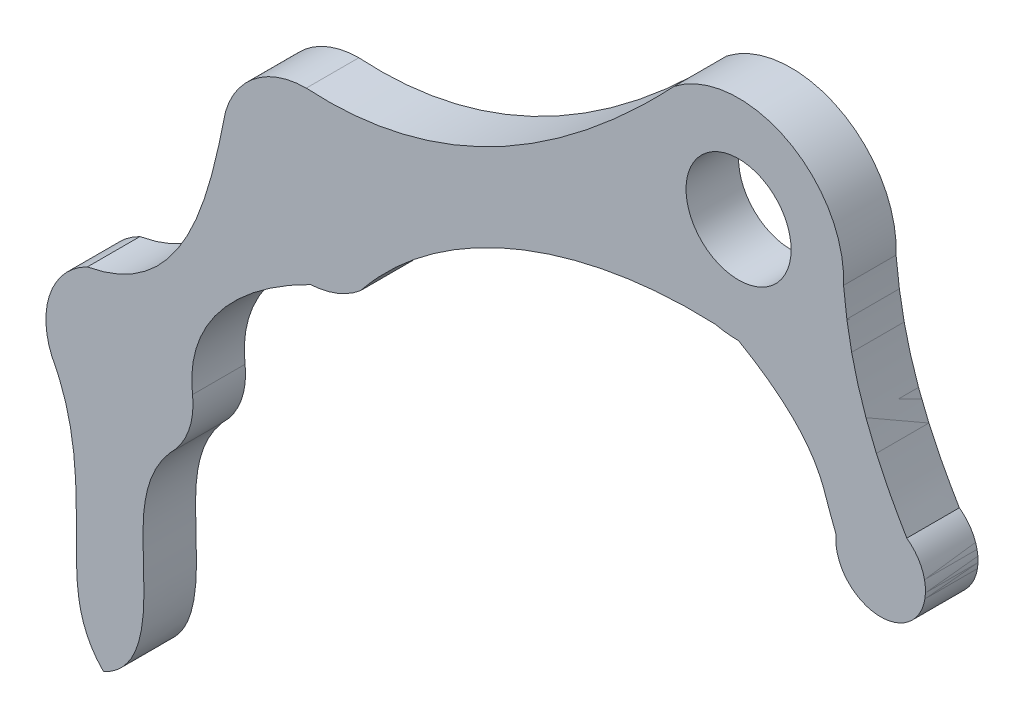
ISO-10303-21;
HEADER;
FILE_DESCRIPTION(('STEP AP214'),'2;1');
FILE_NAME('part.step','',(''),(''),'','','');
FILE_SCHEMA(('AUTOMOTIVE_DESIGN { 1 0 10303 214 1 1 1 1 }'));
ENDSEC;
DATA;
#1=APPLICATION_CONTEXT('core data for automotive mechanical design processes');
#2=APPLICATION_PROTOCOL_DEFINITION('international standard','automotive_design',2000,#1);
#3=PRODUCT_CONTEXT('',#1,'mechanical');
#4=PRODUCT('Part','Part','',(#3));
#5=PRODUCT_RELATED_PRODUCT_CATEGORY('part','',(#4));
#6=PRODUCT_DEFINITION_FORMATION('','',#4);
#7=PRODUCT_DEFINITION_CONTEXT('part definition',#1,'design');
#8=PRODUCT_DEFINITION('design','',#6,#7);
#9=PRODUCT_DEFINITION_SHAPE('','',#8);
#10=(LENGTH_UNIT() NAMED_UNIT(*) SI_UNIT(.MILLI.,.METRE.));
#11=(NAMED_UNIT(*) PLANE_ANGLE_UNIT() SI_UNIT($,.RADIAN.));
#12=(NAMED_UNIT(*) SI_UNIT($,.STERADIAN.) SOLID_ANGLE_UNIT());
#13=UNCERTAINTY_MEASURE_WITH_UNIT(LENGTH_MEASURE(1.E-05),#10,'distance_accuracy_value','');
#14=(GEOMETRIC_REPRESENTATION_CONTEXT(3) GLOBAL_UNCERTAINTY_ASSIGNED_CONTEXT((#13)) GLOBAL_UNIT_ASSIGNED_CONTEXT((#10,
#11,#12)) REPRESENTATION_CONTEXT('',''));
#15=CARTESIAN_POINT('',(0.,0.,0.));
#16=DIRECTION('',(0.,0.,1.));
#17=DIRECTION('',(1.,0.,0.));
#18=AXIS2_PLACEMENT_3D('',#15,#16,#17);
#19=CARTESIAN_POINT('',(9.9899189731047,-0.448908775065759,5.));
#20=CARTESIAN_POINT('',(10.5465937351047,-6.58116234506576,5.));
#21=CARTESIAN_POINT('',(12.2626388431047,-11.8711503130658,5.));
#22=CARTESIAN_POINT('',(15.7976941071047,-17.8958255640658,5.));
#23=CARTESIAN_POINT('',(16.0086181791047,-18.2668651700658,5.));
#24=B_SPLINE_CURVE_WITH_KNOTS('',3,(#19,#20,#21,#22,#23),.UNSPECIFIED.,.F.,.F.,(4,1,4),(0.,
0.616216276367923,0.65661098629915),.UNSPECIFIED.);
#25=DIRECTION('',(0.,0.,-1.));
#26=VECTOR('',#25,1.);
#27=SURFACE_OF_LINEAR_EXTRUSION('',#24,#26);
#28=CARTESIAN_POINT('',(9.9899189731047,-0.448908775065759,0.));
#29=CARTESIAN_POINT('',(10.5465937351047,-6.58116234506576,0.));
#30=CARTESIAN_POINT('',(12.2626388431047,-11.8711503130658,0.));
#31=CARTESIAN_POINT('',(15.7976941071047,-17.8958255640658,0.));
#32=CARTESIAN_POINT('',(16.0086181791047,-18.2668651700658,0.));
#33=B_SPLINE_CURVE_WITH_KNOTS('',3,(#28,#29,#30,#31,#32),.UNSPECIFIED.,.F.,.F.,(4,1,4),(0.,
0.616216276367923,0.65661098629915),.UNSPECIFIED.);
#34=CARTESIAN_POINT('',(9.9899189731047,-0.448908775065759,0.));
#35=VERTEX_POINT('',#34);
#36=CARTESIAN_POINT('',(16.0086181791047,-18.2668651700658,0.));
#37=VERTEX_POINT('',#36);
#38=EDGE_CURVE('E94',#35,#37,#33,.T.);
#39=ORIENTED_EDGE('',*,*,#38,.F.);
#40=DIRECTION('',(0.,0.,-1.));
#41=VECTOR('',#40,1.);
#42=CARTESIAN_POINT('',(9.9899189731047,-0.448908775065759,5.));
#43=LINE('',#42,#41);
#44=CARTESIAN_POINT('',(9.9899189731047,-0.448908775065759,5.));
#45=VERTEX_POINT('',#44);
#46=EDGE_CURVE('E48',#45,#35,#43,.T.);
#47=ORIENTED_EDGE('',*,*,#46,.F.);
#48=CARTESIAN_POINT('',(16.0086181791047,-18.2668651700658,5.));
#49=VERTEX_POINT('',#48);
#50=EDGE_CURVE('E12',#45,#49,#24,.T.);
#51=ORIENTED_EDGE('',*,*,#50,.T.);
#52=DIRECTION('',(0.,0.,-1.));
#53=VECTOR('',#52,1.);
#54=CARTESIAN_POINT('',(16.0086181791047,-18.2668651700658,5.));
#55=LINE('',#54,#53);
#56=EDGE_CURVE('E86',#49,#37,#55,.T.);
#57=ORIENTED_EDGE('',*,*,#56,.T.);
#58=EDGE_LOOP('',(#39,#47,#51,#57));
#59=FACE_BOUND('',#58,.T.);
#60=ADVANCED_FACE('F45',(#59),#27,.T.);
#61=CARTESIAN_POINT('',(13.5206104780507,-21.7339739781482,5.));
#62=DIRECTION('',(0.,0.,-1.));
#63=DIRECTION('',(-1.,0.,0.));
#64=AXIS2_PLACEMENT_3D('',#61,#62,#63);
#65=CYLINDRICAL_SURFACE('',#64,4.26743785046564);
#66=CARTESIAN_POINT('',(13.5206104780507,-21.7339739781482,0.));
#67=DIRECTION('',(0.,0.,-1.));
#68=DIRECTION('',(1.,0.,0.));
#69=AXIS2_PLACEMENT_3D('',#66,#67,#68);
#70=CIRCLE('',#69,4.26743785046564);
#71=CARTESIAN_POINT('',(9.27399303317868,-21.3129441876402,0.));
#72=VERTEX_POINT('',#71);
#73=EDGE_CURVE('E91',#37,#72,#70,.T.);
#74=ORIENTED_EDGE('',*,*,#73,.F.);
#75=ORIENTED_EDGE('',*,*,#56,.F.);
#76=CARTESIAN_POINT('',(13.5206104780507,-21.7339739781482,5.));
#77=DIRECTION('',(0.,0.,-1.));
#78=DIRECTION('',(1.,0.,0.));
#79=AXIS2_PLACEMENT_3D('',#76,#77,#78);
#80=CIRCLE('',#79,4.26743785046564);
#81=CARTESIAN_POINT('',(9.27399303317868,-21.3129441876402,5.));
#82=VERTEX_POINT('',#81);
#83=EDGE_CURVE('E89',#49,#82,#80,.T.);
#84=ORIENTED_EDGE('',*,*,#83,.T.);
#85=DIRECTION('',(0.,0.,-1.));
#86=VECTOR('',#85,1.);
#87=CARTESIAN_POINT('',(9.27399303317868,-21.3129441876402,5.));
#88=LINE('',#87,#86);
#89=EDGE_CURVE('E75',#82,#72,#88,.T.);
#90=ORIENTED_EDGE('',*,*,#89,.T.);
#91=EDGE_LOOP('',(#74,#75,#84,#90));
#92=FACE_BOUND('',#91,.T.);
#93=ADVANCED_FACE('F88',(#92),#65,.T.);
#94=CARTESIAN_POINT('',(9.27399303317868,-21.3129441876402,5.));
#95=CARTESIAN_POINT('',(8.67357700517868,-19.9406809776402,5.));
#96=CARTESIAN_POINT('',(7.51343954717868,-15.0006636276402,5.));
#97=CARTESIAN_POINT('',(2.92672997417868,-11.6867576206402,5.));
#98=CARTESIAN_POINT('',(9.17867787321299E-09,-10.0000000016402,5.));
#99=B_SPLINE_CURVE_WITH_KNOTS('',3,(#94,#95,#96,#97,#98),.UNSPECIFIED.,.F.,.F.,(4,1,4),(0.,
0.195359474976974,0.659664825790197),.UNSPECIFIED.);
#100=DIRECTION('',(0.,0.,-1.));
#101=VECTOR('',#100,1.);
#102=SURFACE_OF_LINEAR_EXTRUSION('',#99,#101);
#103=CARTESIAN_POINT('',(9.27399303317868,-21.3129441876402,0.));
#104=CARTESIAN_POINT('',(8.67357700517868,-19.9406809776402,0.));
#105=CARTESIAN_POINT('',(7.51343954717868,-15.0006636276402,0.));
#106=CARTESIAN_POINT('',(2.92672997417868,-11.6867576206402,0.));
#107=CARTESIAN_POINT('',(9.17867787321299E-09,-10.0000000016402,0.));
#108=B_SPLINE_CURVE_WITH_KNOTS('',3,(#103,#104,#105,#106,#107),.UNSPECIFIED.,.F.,.F.,(4,1,4),
(0.,0.195359474976974,0.659664825790197),.UNSPECIFIED.);
#109=CARTESIAN_POINT('',(9.17867787321299E-09,-10.0000000016402,0.));
#110=VERTEX_POINT('',#109);
#111=EDGE_CURVE('E122',#72,#110,#108,.T.);
#112=ORIENTED_EDGE('',*,*,#111,.F.);
#113=ORIENTED_EDGE('',*,*,#89,.F.);
#114=CARTESIAN_POINT('',(9.17867787321299E-09,-10.0000000016402,5.));
#115=VERTEX_POINT('',#114);
#116=EDGE_CURVE('E106',#82,#115,#99,.T.);
#117=ORIENTED_EDGE('',*,*,#116,.T.);
#118=DIRECTION('',(0.,0.,-1.));
#119=VECTOR('',#118,1.);
#120=CARTESIAN_POINT('',(9.17867787321299E-09,-10.0000000016402,5.));
#121=LINE('',#120,#119);
#122=EDGE_CURVE('E58',#115,#110,#121,.T.);
#123=ORIENTED_EDGE('',*,*,#122,.T.);
#124=EDGE_LOOP('',(#112,#113,#117,#123));
#125=FACE_BOUND('',#124,.T.);
#126=ADVANCED_FACE('F100',(#125),#102,.T.);
#127=OPEN_SHELL('',(#60,#93,#126));
#128=SHELL_BASED_SURFACE_MODEL('B2',(#127));
#129=CARTESIAN_POINT('',(-60.429953363,-67.492405783,5.));
#130=CARTESIAN_POINT('',(-63.035847799,-64.90708051,5.));
#131=CARTESIAN_POINT('',(-63.028170153,-56.438278724,5.));
#132=CARTESIAN_POINT('',(-62.948824726,-48.37679887,5.));
#133=CARTESIAN_POINT('',(-65.366552273,-43.922636472,5.));
#134=B_SPLINE_CURVE_WITH_KNOTS('',3,(#129,#130,#131,#132,#133),.UNSPECIFIED.,.F.,.F.,(4,1,4),
(0.,0.411113631679827,1.),.UNSPECIFIED.);
#135=DIRECTION('',(0.,0.,-1.));
#136=VECTOR('',#135,1.);
#137=SURFACE_OF_LINEAR_EXTRUSION('',#134,#136);
#138=CARTESIAN_POINT('',(-60.429953363,-67.492405783,0.));
#139=CARTESIAN_POINT('',(-63.035847799,-64.90708051,0.));
#140=CARTESIAN_POINT('',(-63.028170153,-56.438278724,0.));
#141=CARTESIAN_POINT('',(-62.948824726,-48.37679887,0.));
#142=CARTESIAN_POINT('',(-65.366552273,-43.922636472,0.));
#143=B_SPLINE_CURVE_WITH_KNOTS('',3,(#138,#139,#140,#141,#142),.UNSPECIFIED.,.F.,.F.,(4,1,4),
(0.,0.411113631679827,1.),.UNSPECIFIED.);
#144=CARTESIAN_POINT('',(-60.429953363,-67.492405783,0.));
#145=VERTEX_POINT('',#144);
#146=CARTESIAN_POINT('',(-65.366552273,-43.922636472,0.));
#147=VERTEX_POINT('',#146);
#148=EDGE_CURVE('E415',#145,#147,#143,.T.);
#149=ORIENTED_EDGE('',*,*,#148,.F.);
#150=DIRECTION('',(0.,0.,-1.));
#151=VECTOR('',#150,1.);
#152=CARTESIAN_POINT('',(-60.429953363,-67.492405783,5.));
#153=LINE('',#152,#151);
#154=CARTESIAN_POINT('',(-60.429953363,-67.492405783,5.));
#155=VERTEX_POINT('',#154);
#156=EDGE_CURVE('E43',#155,#145,#153,.T.);
#157=ORIENTED_EDGE('',*,*,#156,.F.);
#158=CARTESIAN_POINT('',(-65.366552273,-43.922636472,5.));
#159=VERTEX_POINT('',#158);
#160=EDGE_CURVE('E417',#155,#159,#134,.T.);
#161=ORIENTED_EDGE('',*,*,#160,.T.);
#162=DIRECTION('',(0.,0.,-1.));
#163=VECTOR('',#162,1.);
#164=CARTESIAN_POINT('',(-65.366552273,-43.922636472,5.));
#165=LINE('',#164,#163);
#166=EDGE_CURVE('E179',#159,#147,#165,.T.);
#167=ORIENTED_EDGE('',*,*,#166,.T.);
#168=EDGE_LOOP('',(#149,#157,#161,#167));
#169=FACE_BOUND('',#168,.T.);
#170=ADVANCED_FACE('F175',(#169),#137,.T.);
#171=CARTESIAN_POINT('',(-54.130381087,-46.309928491,5.));
#172=CARTESIAN_POINT('',(-57.449959784,-50.201518935,5.));
#173=CARTESIAN_POINT('',(-55.916753892,-57.608938241,5.));
#174=CARTESIAN_POINT('',(-57.103333259,-65.904114864,5.));
#175=CARTESIAN_POINT('',(-60.429953363,-67.492405783,5.));
#176=B_SPLINE_CURVE_WITH_KNOTS('',3,(#171,#172,#173,#174,#175),.UNSPECIFIED.,.F.,.F.,(4,1,4),
(0.,0.57441693739748,1.),.UNSPECIFIED.);
#177=DIRECTION('',(0.,0.,-1.));
#178=VECTOR('',#177,1.);
#179=SURFACE_OF_LINEAR_EXTRUSION('',#176,#178);
#180=CARTESIAN_POINT('',(-54.130381087,-46.309928491,0.));
#181=CARTESIAN_POINT('',(-57.449959784,-50.201518935,0.));
#182=CARTESIAN_POINT('',(-55.916753892,-57.608938241,0.));
#183=CARTESIAN_POINT('',(-57.103333259,-65.904114864,0.));
#184=CARTESIAN_POINT('',(-60.429953363,-67.492405783,0.));
#185=B_SPLINE_CURVE_WITH_KNOTS('',3,(#180,#181,#182,#183,#184),.UNSPECIFIED.,.F.,.F.,(4,1,4),
(0.,0.57441693739748,1.),.UNSPECIFIED.);
#186=CARTESIAN_POINT('',(-54.130381087,-46.309928491,0.));
#187=VERTEX_POINT('',#186);
#188=EDGE_CURVE('E423',#187,#145,#185,.T.);
#189=ORIENTED_EDGE('',*,*,#188,.F.);
#190=DIRECTION('',(0.,0.,-1.));
#191=VECTOR('',#190,1.);
#192=CARTESIAN_POINT('',(-54.130381087,-46.309928491,5.));
#193=LINE('',#192,#191);
#194=CARTESIAN_POINT('',(-54.130381087,-46.309928491,5.));
#195=VERTEX_POINT('',#194);
#196=EDGE_CURVE('E185',#195,#187,#193,.T.);
#197=ORIENTED_EDGE('',*,*,#196,.F.);
#198=EDGE_CURVE('E299',#195,#155,#176,.T.);
#199=ORIENTED_EDGE('',*,*,#198,.T.);
#200=ORIENTED_EDGE('',*,*,#156,.T.);
#201=EDGE_LOOP('',(#189,#197,#199,#200));
#202=FACE_BOUND('',#201,.T.);
#203=ADVANCED_FACE('F447',(#202),#179,.T.);
#204=CARTESIAN_POINT('',(-58.9168429668447,-41.2021126484925,5.));
#205=DIRECTION('',(0.,0.,-1.));
#206=DIRECTION('',(-1.,0.,0.));
#207=AXIS2_PLACEMENT_3D('',#204,#205,#206);
#208=CYLINDRICAL_SURFACE('',#207,7.00000000058409);
#209=CARTESIAN_POINT('',(-58.9168429668447,-41.2021126484925,0.));
#210=DIRECTION('',(0.,0.,-1.));
#211=DIRECTION('',(-1.,0.,0.));
#212=AXIS2_PLACEMENT_3D('',#209,#210,#211);
#213=CIRCLE('',#212,7.00000000058409);
#214=CARTESIAN_POINT('',(-51.9607603703315,-40.4192238194348,0.));
#215=VERTEX_POINT('',#214);
#216=EDGE_CURVE('E286',#215,#187,#213,.T.);
#217=ORIENTED_EDGE('',*,*,#216,.F.);
#218=DIRECTION('',(0.,0.,-1.));
#219=VECTOR('',#218,1.);
#220=CARTESIAN_POINT('',(-51.9607603703315,-40.4192238194348,5.));
#221=LINE('',#220,#219);
#222=CARTESIAN_POINT('',(-51.9607603703315,-40.4192238194348,5.));
#223=VERTEX_POINT('',#222);
#224=EDGE_CURVE('E281',#223,#215,#221,.T.);
#225=ORIENTED_EDGE('',*,*,#224,.F.);
#226=CARTESIAN_POINT('',(-58.9168429668447,-41.2021126484925,5.));
#227=DIRECTION('',(0.,0.,-1.));
#228=DIRECTION('',(-1.,0.,0.));
#229=AXIS2_PLACEMENT_3D('',#226,#227,#228);
#230=CIRCLE('',#229,7.00000000058409);
#231=EDGE_CURVE('E284',#223,#195,#230,.T.);
#232=ORIENTED_EDGE('',*,*,#231,.T.);
#233=ORIENTED_EDGE('',*,*,#196,.T.);
#234=EDGE_LOOP('',(#217,#225,#232,#233));
#235=FACE_BOUND('',#234,.T.);
#236=ADVANCED_FACE('F283',(#235),#208,.T.);
#237=CARTESIAN_POINT('',(-40.7273454473315,-25.7383652264348,5.));
#238=CARTESIAN_POINT('',(-46.1444167973315,-28.3742131664348,5.));
#239=CARTESIAN_POINT('',(-52.8002641013315,-33.4878347844347,5.));
#240=CARTESIAN_POINT('',(-51.9607603703315,-40.4192238194348,5.));
#241=B_SPLINE_CURVE_WITH_KNOTS('',3,(#237,#238,#239,#240),.UNSPECIFIED.,.F.,.F.,(4,4),(0.,1.),.UNSPECIFIED.);
#242=DIRECTION('',(0.,0.,-1.));
#243=VECTOR('',#242,1.);
#244=SURFACE_OF_LINEAR_EXTRUSION('',#241,#243);
#245=CARTESIAN_POINT('',(-40.7273454473315,-25.7383652264348,0.));
#246=CARTESIAN_POINT('',(-46.1444167973315,-28.3742131664348,0.));
#247=CARTESIAN_POINT('',(-52.8002641013315,-33.4878347844347,0.));
#248=CARTESIAN_POINT('',(-51.9607603703315,-40.4192238194348,0.));
#249=B_SPLINE_CURVE_WITH_KNOTS('',3,(#245,#246,#247,#248),.UNSPECIFIED.,.F.,.F.,(4,4),(0.,1.),.UNSPECIFIED.);
#250=CARTESIAN_POINT('',(-40.7273454473315,-25.7383652264348,0.));
#251=VERTEX_POINT('',#250);
#252=EDGE_CURVE('E458',#251,#215,#249,.T.);
#253=ORIENTED_EDGE('',*,*,#252,.F.);
#254=DIRECTION('',(0.,0.,-1.));
#255=VECTOR('',#254,1.);
#256=CARTESIAN_POINT('',(-40.7273454473315,-25.7383652264348,5.));
#257=LINE('',#256,#255);
#258=CARTESIAN_POINT('',(-40.7273454473315,-25.7383652264348,5.));
#259=VERTEX_POINT('',#258);
#260=EDGE_CURVE('E291',#259,#251,#257,.T.);
#261=ORIENTED_EDGE('',*,*,#260,.F.);
#262=EDGE_CURVE('E297',#259,#223,#241,.T.);
#263=ORIENTED_EDGE('',*,*,#262,.T.);
#264=ORIENTED_EDGE('',*,*,#224,.T.);
#265=EDGE_LOOP('',(#253,#261,#263,#264));
#266=FACE_BOUND('',#265,.T.);
#267=ADVANCED_FACE('F301',(#266),#244,.T.);
#268=CARTESIAN_POINT('',(-41.137795808973,-17.7489015095505,5.));
#269=DIRECTION('',(0.,0.,-1.));
#270=DIRECTION('',(-1.,0.,0.));
#271=AXIS2_PLACEMENT_3D('',#268,#269,#270);
#272=CYLINDRICAL_SURFACE('',#271,7.99999999892386);
#273=CARTESIAN_POINT('',(-41.137795808973,-17.7489015095505,0.));
#274=DIRECTION('',(0.,0.,-1.));
#275=DIRECTION('',(-1.,0.,0.));
#276=AXIS2_PLACEMENT_3D('',#273,#274,#275);
#277=CIRCLE('',#276,7.99999999892386);
#278=CARTESIAN_POINT('',(-35.9788282963538,-23.8632333770992,0.));
#279=VERTEX_POINT('',#278);
#280=EDGE_CURVE('E670',#279,#251,#277,.T.);
#281=ORIENTED_EDGE('',*,*,#280,.F.);
#282=DIRECTION('',(0.,0.,-1.));
#283=VECTOR('',#282,1.);
#284=CARTESIAN_POINT('',(-35.9788282963538,-23.8632333770992,5.));
#285=LINE('',#284,#283);
#286=CARTESIAN_POINT('',(-35.9788282963538,-23.8632333770992,5.));
#287=VERTEX_POINT('',#286);
#288=EDGE_CURVE('E469',#287,#279,#285,.T.);
#289=ORIENTED_EDGE('',*,*,#288,.F.);
#290=CARTESIAN_POINT('',(-41.137795808973,-17.7489015095505,5.));
#291=DIRECTION('',(0.,0.,-1.));
#292=DIRECTION('',(-1.,0.,0.));
#293=AXIS2_PLACEMENT_3D('',#290,#291,#292);
#294=CIRCLE('',#293,7.99999999892386);
#295=EDGE_CURVE('E302',#287,#259,#294,.T.);
#296=ORIENTED_EDGE('',*,*,#295,.T.);
#297=ORIENTED_EDGE('',*,*,#260,.T.);
#298=EDGE_LOOP('',(#281,#289,#296,#297));
#299=FACE_BOUND('',#298,.T.);
#300=ADVANCED_FACE('F318',(#299),#272,.T.);
#301=CARTESIAN_POINT('',(-2.2268631203538,-9.74890150909918,5.));
#302=CARTESIAN_POINT('',(-14.6751841963538,-9.20556970409918,5.));
#303=CARTESIAN_POINT('',(-28.0581194933538,-13.9409589860992,5.));
#304=CARTESIAN_POINT('',(-35.9788282963538,-23.8632333770992,5.));
#305=B_SPLINE_CURVE_WITH_KNOTS('',3,(#301,#302,#303,#304),.UNSPECIFIED.,.F.,.F.,(4,4),(0.,1.),.UNSPECIFIED.);
#306=DIRECTION('',(0.,0.,-1.));
#307=VECTOR('',#306,1.);
#308=SURFACE_OF_LINEAR_EXTRUSION('',#305,#307);
#309=CARTESIAN_POINT('',(-2.2268631203538,-9.74890150909918,0.));
#310=CARTESIAN_POINT('',(-14.6751841963538,-9.20556970409918,0.));
#311=CARTESIAN_POINT('',(-28.0581194933538,-13.9409589860992,0.));
#312=CARTESIAN_POINT('',(-35.9788282963538,-23.8632333770992,0.));
#313=B_SPLINE_CURVE_WITH_KNOTS('',3,(#309,#310,#311,#312),.UNSPECIFIED.,.F.,.F.,(4,4),(0.,1.),.UNSPECIFIED.);
#314=CARTESIAN_POINT('',(-2.2268631203538,-9.74890150909918,0.));
#315=VERTEX_POINT('',#314);
#316=EDGE_CURVE('E665',#315,#279,#313,.T.);
#317=ORIENTED_EDGE('',*,*,#316,.F.);
#318=DIRECTION('',(0.,0.,-1.));
#319=VECTOR('',#318,1.);
#320=CARTESIAN_POINT('',(-2.2268631203538,-9.74890150909918,5.));
#321=LINE('',#320,#319);
#322=CARTESIAN_POINT('',(-2.2268631203538,-9.74890150909918,5.));
#323=VERTEX_POINT('',#322);
#324=EDGE_CURVE('E471',#323,#315,#321,.T.);
#325=ORIENTED_EDGE('',*,*,#324,.F.);
#326=EDGE_CURVE('E304',#323,#287,#305,.T.);
#327=ORIENTED_EDGE('',*,*,#326,.T.);
#328=ORIENTED_EDGE('',*,*,#288,.T.);
#329=EDGE_LOOP('',(#317,#325,#327,#328));
#330=FACE_BOUND('',#329,.T.);
#331=ADVANCED_FACE('F322',(#330),#308,.T.);
#332=CARTESIAN_POINT('',(9.17867951782947E-09,-2.02406602763106E-09,5.));
#333=DIRECTION('',(0.,0.,-1.));
#334=DIRECTION('',(-1.,0.,0.));
#335=AXIS2_PLACEMENT_3D('',#332,#333,#334);
#336=CYLINDRICAL_SURFACE('',#335,9.99999999961613);
#337=CARTESIAN_POINT('',(9.17867951782947E-09,-2.02406602763106E-09,0.));
#338=DIRECTION('',(0.,0.,-1.));
#339=DIRECTION('',(-1.,0.,0.));
#340=AXIS2_PLACEMENT_3D('',#337,#338,#339);
#341=CIRCLE('',#340,9.99999999961613);
#342=CARTESIAN_POINT('',(9.17867787321299E-09,-10.0000000016402,0.));
#343=VERTEX_POINT('',#342);
#344=EDGE_CURVE('E659',#343,#315,#341,.T.);
#345=ORIENTED_EDGE('',*,*,#344,.F.);
#346=DIRECTION('',(0.,0.,-1.));
#347=VECTOR('',#346,1.);
#348=CARTESIAN_POINT('',(9.17867787321299E-09,-10.0000000016402,5.));
#349=LINE('',#348,#347);
#350=CARTESIAN_POINT('',(9.17867787321299E-09,-10.0000000016402,5.));
#351=VERTEX_POINT('',#350);
#352=EDGE_CURVE('E473',#351,#343,#349,.T.);
#353=ORIENTED_EDGE('',*,*,#352,.F.);
#354=CARTESIAN_POINT('',(9.17867951782947E-09,-2.02406602763106E-09,5.));
#355=DIRECTION('',(0.,0.,-1.));
#356=DIRECTION('',(-1.,0.,0.));
#357=AXIS2_PLACEMENT_3D('',#354,#355,#356);
#358=CIRCLE('',#357,9.99999999961613);
#359=EDGE_CURVE('E334',#351,#323,#358,.T.);
#360=ORIENTED_EDGE('',*,*,#359,.T.);
#361=ORIENTED_EDGE('',*,*,#324,.T.);
#362=EDGE_LOOP('',(#345,#353,#360,#361));
#363=FACE_BOUND('',#362,.T.);
#364=ADVANCED_FACE('F326',(#363),#336,.T.);
#365=CARTESIAN_POINT('',(9.27399303317868,-21.3129441876402,5.));
#366=CARTESIAN_POINT('',(8.67357700517868,-19.9406809776402,5.));
#367=CARTESIAN_POINT('',(7.51343954717868,-15.0006636276402,5.));
#368=CARTESIAN_POINT('',(2.92672997417868,-11.6867576206402,5.));
#369=CARTESIAN_POINT('',(9.17867787321299E-09,-10.0000000016402,5.));
#370=B_SPLINE_CURVE_WITH_KNOTS('',3,(#365,#366,#367,#368,#369),.UNSPECIFIED.,.F.,.F.,(4,1,4),
(0.,0.195359474976974,0.659664825790197),.UNSPECIFIED.);
#371=DIRECTION('',(0.,0.,-1.));
#372=VECTOR('',#371,1.);
#373=SURFACE_OF_LINEAR_EXTRUSION('',#370,#372);
#374=CARTESIAN_POINT('',(9.27399303317868,-21.3129441876402,0.));
#375=CARTESIAN_POINT('',(8.67357700517868,-19.9406809776402,0.));
#376=CARTESIAN_POINT('',(7.51343954717868,-15.0006636276402,0.));
#377=CARTESIAN_POINT('',(2.92672997417868,-11.6867576206402,0.));
#378=CARTESIAN_POINT('',(9.17867787321299E-09,-10.0000000016402,0.));
#379=B_SPLINE_CURVE_WITH_KNOTS('',3,(#374,#375,#376,#377,#378),.UNSPECIFIED.,.F.,.F.,(4,1,4),
(0.,0.195359474976974,0.659664825790197),.UNSPECIFIED.);
#380=CARTESIAN_POINT('',(9.27399303317868,-21.3129441876402,0.));
#381=VERTEX_POINT('',#380);
#382=EDGE_CURVE('E651',#381,#343,#379,.T.);
#383=ORIENTED_EDGE('',*,*,#382,.F.);
#384=DIRECTION('',(0.,0.,-1.));
#385=VECTOR('',#384,1.);
#386=CARTESIAN_POINT('',(9.27399303317868,-21.3129441876402,5.));
#387=LINE('',#386,#385);
#388=CARTESIAN_POINT('',(9.27399303317868,-21.3129441876402,5.));
#389=VERTEX_POINT('',#388);
#390=EDGE_CURVE('E475',#389,#381,#387,.T.);
#391=ORIENTED_EDGE('',*,*,#390,.F.);
#392=EDGE_CURVE('E340',#389,#351,#370,.T.);
#393=ORIENTED_EDGE('',*,*,#392,.T.);
#394=ORIENTED_EDGE('',*,*,#352,.T.);
#395=EDGE_LOOP('',(#383,#391,#393,#394));
#396=FACE_BOUND('',#395,.T.);
#397=ADVANCED_FACE('F354',(#396),#373,.T.);
#398=CARTESIAN_POINT('',(9.9899189731047,-0.448908775065759,5.));
#399=CARTESIAN_POINT('',(10.5465937351047,-6.58116234506576,5.));
#400=CARTESIAN_POINT('',(12.2626388431047,-11.8711503130658,5.));
#401=CARTESIAN_POINT('',(15.7976941071047,-17.8958255640658,5.));
#402=CARTESIAN_POINT('',(16.0086181791047,-18.2668651700658,5.));
#403=B_SPLINE_CURVE_WITH_KNOTS('',3,(#398,#399,#400,#401,#402),.UNSPECIFIED.,.F.,.F.,(4,1,4),
(0.,0.616216276367923,0.65661098629915),.UNSPECIFIED.);
#404=DIRECTION('',(0.,0.,-1.));
#405=VECTOR('',#404,1.);
#406=SURFACE_OF_LINEAR_EXTRUSION('',#403,#405);
#407=CARTESIAN_POINT('',(9.9899189731047,-0.448908775065759,0.));
#408=CARTESIAN_POINT('',(10.5465937351047,-6.58116234506576,0.));
#409=CARTESIAN_POINT('',(12.2626388431047,-11.8711503130658,0.));
#410=CARTESIAN_POINT('',(15.7976941071047,-17.8958255640658,0.));
#411=CARTESIAN_POINT('',(16.0086181791047,-18.2668651700658,0.));
#412=B_SPLINE_CURVE_WITH_KNOTS('',3,(#407,#408,#409,#410,#411),.UNSPECIFIED.,.F.,.F.,(4,1,4),
(0.,0.616216276367923,0.65661098629915),.UNSPECIFIED.);
#413=CARTESIAN_POINT('',(9.9899189731047,-0.448908775065758,0.));
#414=VERTEX_POINT('',#413);
#415=CARTESIAN_POINT('',(16.0086181791047,-18.2668651700658,0.));
#416=VERTEX_POINT('',#415);
#417=EDGE_CURVE('E647',#414,#416,#412,.T.);
#418=ORIENTED_EDGE('',*,*,#417,.F.);
#419=DIRECTION('',(0.,0.,-1.));
#420=VECTOR('',#419,1.);
#421=CARTESIAN_POINT('',(9.9899189731047,-0.448908775065758,5.));
#422=LINE('',#421,#420);
#423=CARTESIAN_POINT('',(9.9899189731047,-0.448908775065758,5.));
#424=VERTEX_POINT('',#423);
#425=EDGE_CURVE('E396',#424,#414,#422,.T.);
#426=ORIENTED_EDGE('',*,*,#425,.F.);
#427=CARTESIAN_POINT('',(16.0086181791047,-18.2668651700658,5.));
#428=VERTEX_POINT('',#427);
#429=EDGE_CURVE('E346',#424,#428,#403,.T.);
#430=ORIENTED_EDGE('',*,*,#429,.T.);
#431=DIRECTION('',(0.,0.,-1.));
#432=VECTOR('',#431,1.);
#433=CARTESIAN_POINT('',(16.0086181791047,-18.2668651700658,5.));
#434=LINE('',#433,#432);
#435=EDGE_CURVE('E394',#428,#416,#434,.T.);
#436=ORIENTED_EDGE('',*,*,#435,.T.);
#437=EDGE_LOOP('',(#418,#426,#430,#436));
#438=FACE_BOUND('',#437,.T.);
#439=ADVANCED_FACE('F357',(#438),#406,.T.);
#440=CARTESIAN_POINT('',(9.17867951782947E-09,-2.02406602763106E-09,5.));
#441=DIRECTION('',(0.,0.,-1.));
#442=DIRECTION('',(-1.,0.,0.));
#443=AXIS2_PLACEMENT_3D('',#440,#441,#442);
#444=CYLINDRICAL_SURFACE('',#443,9.99999999961613);
#445=CARTESIAN_POINT('',(9.17867951782947E-09,-2.02406602763106E-09,0.));
#446=DIRECTION('',(0.,0.,-1.));
#447=DIRECTION('',(-1.,0.,0.));
#448=AXIS2_PLACEMENT_3D('',#445,#446,#447);
#449=CIRCLE('',#448,9.99999999961613);
#450=CARTESIAN_POINT('',(-6.13166602059695,7.89953616737336,0.));
#451=VERTEX_POINT('',#450);
#452=EDGE_CURVE('E641',#451,#414,#449,.T.);
#453=ORIENTED_EDGE('',*,*,#452,.F.);
#454=DIRECTION('',(0.,0.,-1.));
#455=VECTOR('',#454,1.);
#456=CARTESIAN_POINT('',(-6.13166602059695,7.89953616737336,5.));
#457=LINE('',#456,#455);
#458=CARTESIAN_POINT('',(-6.13166602059695,7.89953616737336,5.));
#459=VERTEX_POINT('',#458);
#460=EDGE_CURVE('E479',#459,#451,#457,.T.);
#461=ORIENTED_EDGE('',*,*,#460,.F.);
#462=CARTESIAN_POINT('',(9.17867951782947E-09,-2.02406602763106E-09,5.));
#463=DIRECTION('',(0.,0.,-1.));
#464=DIRECTION('',(-1.,0.,0.));
#465=AXIS2_PLACEMENT_3D('',#462,#463,#464);
#466=CIRCLE('',#465,9.99999999961613);
#467=EDGE_CURVE('E379',#459,#424,#466,.T.);
#468=ORIENTED_EDGE('',*,*,#467,.T.);
#469=ORIENTED_EDGE('',*,*,#425,.T.);
#470=EDGE_LOOP('',(#453,#461,#468,#469));
#471=FACE_BOUND('',#470,.T.);
#472=ADVANCED_FACE('F361',(#471),#444,.T.);
#473=CARTESIAN_POINT('',(-41.137795801597,-9.74890151062664,5.));
#474=CARTESIAN_POINT('',(-27.2451166495969,-10.6659184816266,5.));
#475=CARTESIAN_POINT('',(-15.1399720315969,-1.65620241862664,5.));
#476=CARTESIAN_POINT('',(-6.13166602059695,7.89953616737336,5.));
#477=B_SPLINE_CURVE_WITH_KNOTS('',3,(#473,#474,#475,#476),.UNSPECIFIED.,.F.,.F.,(4,4),(0.,1.),.UNSPECIFIED.);
#478=DIRECTION('',(0.,0.,-1.));
#479=VECTOR('',#478,1.);
#480=SURFACE_OF_LINEAR_EXTRUSION('',#477,#479);
#481=CARTESIAN_POINT('',(-41.137795801597,-9.74890151062664,0.));
#482=CARTESIAN_POINT('',(-27.2451166495969,-10.6659184816266,0.));
#483=CARTESIAN_POINT('',(-15.1399720315969,-1.65620241862664,0.));
#484=CARTESIAN_POINT('',(-6.13166602059695,7.89953616737336,0.));
#485=B_SPLINE_CURVE_WITH_KNOTS('',3,(#481,#482,#483,#484),.UNSPECIFIED.,.F.,.F.,(4,4),(0.,1.),.UNSPECIFIED.);
#486=CARTESIAN_POINT('',(-41.137795801597,-9.74890151062664,0.));
#487=VERTEX_POINT('',#486);
#488=EDGE_CURVE('E628',#487,#451,#485,.T.);
#489=ORIENTED_EDGE('',*,*,#488,.F.);
#490=DIRECTION('',(0.,0.,-1.));
#491=VECTOR('',#490,1.);
#492=CARTESIAN_POINT('',(-41.137795801597,-9.74890151062664,5.));
#493=LINE('',#492,#491);
#494=CARTESIAN_POINT('',(-41.137795801597,-9.74890151062664,5.));
#495=VERTEX_POINT('',#494);
#496=EDGE_CURVE('E481',#495,#487,#493,.T.);
#497=ORIENTED_EDGE('',*,*,#496,.F.);
#498=EDGE_CURVE('E373',#495,#459,#477,.T.);
#499=ORIENTED_EDGE('',*,*,#498,.T.);
#500=ORIENTED_EDGE('',*,*,#460,.T.);
#501=EDGE_LOOP('',(#489,#497,#499,#500));
#502=FACE_BOUND('',#501,.T.);
#503=ADVANCED_FACE('F365',(#502),#480,.T.);
#504=CARTESIAN_POINT('',(-41.137795808973,-17.7489015095505,5.));
#505=DIRECTION('',(0.,0.,-1.));
#506=DIRECTION('',(-1.,0.,0.));
#507=AXIS2_PLACEMENT_3D('',#504,#505,#506);
#508=CYLINDRICAL_SURFACE('',#507,7.99999999892386);
#509=CARTESIAN_POINT('',(-41.137795808973,-17.7489015095505,0.));
#510=DIRECTION('',(0.,0.,-1.));
#511=DIRECTION('',(-1.,0.,0.));
#512=AXIS2_PLACEMENT_3D('',#509,#510,#511);
#513=CIRCLE('',#512,7.99999999892386);
#514=CARTESIAN_POINT('',(-48.815695062704,-15.5017114792373,0.));
#515=VERTEX_POINT('',#514);
#516=EDGE_CURVE('E622',#515,#487,#513,.T.);
#517=ORIENTED_EDGE('',*,*,#516,.F.);
#518=DIRECTION('',(0.,0.,-1.));
#519=VECTOR('',#518,1.);
#520=CARTESIAN_POINT('',(-48.815695062704,-15.5017114792373,5.));
#521=LINE('',#520,#519);
#522=CARTESIAN_POINT('',(-48.815695062704,-15.5017114792373,5.));
#523=VERTEX_POINT('',#522);
#524=EDGE_CURVE('E483',#523,#515,#521,.T.);
#525=ORIENTED_EDGE('',*,*,#524,.F.);
#526=CARTESIAN_POINT('',(-41.137795808973,-17.7489015095505,5.));
#527=DIRECTION('',(0.,0.,-1.));
#528=DIRECTION('',(-1.,0.,0.));
#529=AXIS2_PLACEMENT_3D('',#526,#527,#528);
#530=CIRCLE('',#529,7.99999999892386);
#531=EDGE_CURVE('E380',#523,#495,#530,.T.);
#532=ORIENTED_EDGE('',*,*,#531,.T.);
#533=ORIENTED_EDGE('',*,*,#496,.T.);
#534=EDGE_LOOP('',(#517,#525,#532,#533));
#535=FACE_BOUND('',#534,.T.);
#536=ADVANCED_FACE('F370',(#535),#508,.T.);
#537=CARTESIAN_POINT('',(-61.975170700704,-34.9055555352373,5.));
#538=CARTESIAN_POINT('',(-52.395963262704,-33.1575220672373,5.));
#539=CARTESIAN_POINT('',(-50.328955684704,-23.0829064512373,5.));
#540=CARTESIAN_POINT('',(-48.815695062704,-15.5017114792373,5.));
#541=B_SPLINE_CURVE_WITH_KNOTS('',3,(#537,#538,#539,#540),.UNSPECIFIED.,.F.,.F.,(4,4),(0.,1.),.UNSPECIFIED.);
#542=DIRECTION('',(0.,0.,-1.));
#543=VECTOR('',#542,1.);
#544=SURFACE_OF_LINEAR_EXTRUSION('',#541,#543);
#545=CARTESIAN_POINT('',(-61.975170700704,-34.9055555352373,0.));
#546=CARTESIAN_POINT('',(-52.395963262704,-33.1575220672373,0.));
#547=CARTESIAN_POINT('',(-50.328955684704,-23.0829064512373,0.));
#548=CARTESIAN_POINT('',(-48.815695062704,-15.5017114792373,0.));
#549=B_SPLINE_CURVE_WITH_KNOTS('',3,(#545,#546,#547,#548),.UNSPECIFIED.,.F.,.F.,(4,4),(0.,1.),.UNSPECIFIED.);
#550=CARTESIAN_POINT('',(-61.975170700704,-34.9055555352373,0.));
#551=VERTEX_POINT('',#550);
#552=EDGE_CURVE('E629',#551,#515,#549,.T.);
#553=ORIENTED_EDGE('',*,*,#552,.F.);
#554=DIRECTION('',(0.,0.,-1.));
#555=VECTOR('',#554,1.);
#556=CARTESIAN_POINT('',(-61.975170700704,-34.9055555352373,5.));
#557=LINE('',#556,#555);
#558=CARTESIAN_POINT('',(-61.975170700704,-34.9055555352373,5.));
#559=VERTEX_POINT('',#558);
#560=EDGE_CURVE('E484',#559,#551,#557,.T.);
#561=ORIENTED_EDGE('',*,*,#560,.F.);
#562=EDGE_CURVE('E427',#559,#523,#541,.T.);
#563=ORIENTED_EDGE('',*,*,#562,.T.);
#564=ORIENTED_EDGE('',*,*,#524,.T.);
#565=EDGE_LOOP('',(#553,#561,#563,#564));
#566=FACE_BOUND('',#565,.T.);
#567=ADVANCED_FACE('F435',(#566),#544,.T.);
#568=CARTESIAN_POINT('',(-58.9168429668447,-41.2021126484925,5.));
#569=DIRECTION('',(0.,0.,-1.));
#570=DIRECTION('',(-1.,0.,0.));
#571=AXIS2_PLACEMENT_3D('',#568,#569,#570);
#572=CYLINDRICAL_SURFACE('',#571,7.0000000005841);
#573=CARTESIAN_POINT('',(-58.9168429668447,-41.2021126484925,0.));
#574=DIRECTION('',(0.,0.,-1.));
#575=DIRECTION('',(-1.,0.,0.));
#576=AXIS2_PLACEMENT_3D('',#573,#574,#575);
#577=CIRCLE('',#576,7.0000000005841);
#578=EDGE_CURVE('E455',#147,#551,#577,.T.);
#579=ORIENTED_EDGE('',*,*,#578,.F.);
#580=ORIENTED_EDGE('',*,*,#166,.F.);
#581=CARTESIAN_POINT('',(-58.9168429668447,-41.2021126484925,5.));
#582=DIRECTION('',(0.,0.,-1.));
#583=DIRECTION('',(-1.,0.,0.));
#584=AXIS2_PLACEMENT_3D('',#581,#582,#583);
#585=CIRCLE('',#584,7.0000000005841);
#586=EDGE_CURVE('E422',#159,#559,#585,.T.);
#587=ORIENTED_EDGE('',*,*,#586,.T.);
#588=ORIENTED_EDGE('',*,*,#560,.T.);
#589=EDGE_LOOP('',(#579,#580,#587,#588));
#590=FACE_BOUND('',#589,.T.);
#591=ADVANCED_FACE('F437',(#590),#572,.T.);
#592=CARTESIAN_POINT('',(-63.0143797006138,-55.8091913064879,5.));
#593=DIRECTION('',(0.,0.,1.));
#594=DIRECTION('',(1.,0.,0.));
#595=AXIS2_PLACEMENT_3D('',#592,#593,#594);
#596=PLANE('',#595);
#597=CARTESIAN_POINT('',(9.17867951782947E-09,-2.02406602763106E-09,5.));
#598=DIRECTION('',(0.,0.,-1.));
#599=DIRECTION('',(1.,0.,0.));
#600=AXIS2_PLACEMENT_3D('',#597,#598,#599);
#601=CIRCLE('',#600,5.00000000202407);
#602=CARTESIAN_POINT('',(5.00000001120274,-2.02406602763106E-09,5.));
#603=VERTEX_POINT('',#602);
#604=EDGE_CURVE('E412',#603,#603,#601,.T.);
#605=ORIENTED_EDGE('',*,*,#604,.T.);
#606=EDGE_LOOP('',(#605));
#607=FACE_BOUND('',#606,.T.);
#608=ORIENTED_EDGE('',*,*,#160,.F.);
#609=ORIENTED_EDGE('',*,*,#198,.F.);
#610=ORIENTED_EDGE('',*,*,#231,.F.);
#611=ORIENTED_EDGE('',*,*,#262,.F.);
#612=ORIENTED_EDGE('',*,*,#295,.F.);
#613=ORIENTED_EDGE('',*,*,#326,.F.);
#614=ORIENTED_EDGE('',*,*,#359,.F.);
#615=ORIENTED_EDGE('',*,*,#392,.F.);
#616=CARTESIAN_POINT('',(13.5206104780507,-21.7339739781482,5.));
#617=DIRECTION('',(0.,0.,1.));
#618=DIRECTION('',(1.,0.,0.));
#619=AXIS2_PLACEMENT_3D('',#616,#617,#618);
#620=CIRCLE('',#619,4.26743785046564);
#621=EDGE_CURVE('E401',#389,#428,#620,.T.);
#622=ORIENTED_EDGE('',*,*,#621,.T.);
#623=ORIENTED_EDGE('',*,*,#429,.F.);
#624=ORIENTED_EDGE('',*,*,#467,.F.);
#625=ORIENTED_EDGE('',*,*,#498,.F.);
#626=ORIENTED_EDGE('',*,*,#531,.F.);
#627=ORIENTED_EDGE('',*,*,#562,.F.);
#628=ORIENTED_EDGE('',*,*,#586,.F.);
#629=EDGE_LOOP('',(#608,#609,#610,#611,#612,#613,#614,#615,#622,#623,#624,#625,#626,#627,#628));
#630=FACE_BOUND('',#629,.T.);
#631=ADVANCED_FACE('F295',(#607,#630),#596,.T.);
#632=CARTESIAN_POINT('',(-63.0143797006138,-55.8091913064879,0.));
#633=DIRECTION('',(0.,0.,1.));
#634=DIRECTION('',(1.,0.,0.));
#635=AXIS2_PLACEMENT_3D('',#632,#633,#634);
#636=PLANE('',#635);
#637=CARTESIAN_POINT('',(9.17867951782947E-09,-2.02406602763106E-09,0.));
#638=DIRECTION('',(0.,0.,-1.));
#639=DIRECTION('',(1.,0.,0.));
#640=AXIS2_PLACEMENT_3D('',#637,#638,#639);
#641=CIRCLE('',#640,5.00000000202407);
#642=CARTESIAN_POINT('',(5.00000001120274,-2.02406602763106E-09,0.));
#643=VERTEX_POINT('',#642);
#644=EDGE_CURVE('E409',#643,#643,#641,.T.);
#645=ORIENTED_EDGE('',*,*,#644,.F.);
#646=EDGE_LOOP('',(#645));
#647=FACE_BOUND('',#646,.T.);
#648=ORIENTED_EDGE('',*,*,#148,.T.);
#649=ORIENTED_EDGE('',*,*,#578,.T.);
#650=ORIENTED_EDGE('',*,*,#552,.T.);
#651=ORIENTED_EDGE('',*,*,#516,.T.);
#652=ORIENTED_EDGE('',*,*,#488,.T.);
#653=ORIENTED_EDGE('',*,*,#452,.T.);
#654=ORIENTED_EDGE('',*,*,#417,.T.);
#655=CARTESIAN_POINT('',(13.5206104780507,-21.7339739781482,0.));
#656=DIRECTION('',(0.,0.,1.));
#657=DIRECTION('',(1.,0.,0.));
#658=AXIS2_PLACEMENT_3D('',#655,#656,#657);
#659=CIRCLE('',#658,4.26743785046564);
#660=EDGE_CURVE('E406',#381,#416,#659,.T.);
#661=ORIENTED_EDGE('',*,*,#660,.F.);
#662=ORIENTED_EDGE('',*,*,#382,.T.);
#663=ORIENTED_EDGE('',*,*,#344,.T.);
#664=ORIENTED_EDGE('',*,*,#316,.T.);
#665=ORIENTED_EDGE('',*,*,#280,.T.);
#666=ORIENTED_EDGE('',*,*,#252,.T.);
#667=ORIENTED_EDGE('',*,*,#216,.T.);
#668=ORIENTED_EDGE('',*,*,#188,.T.);
#669=EDGE_LOOP('',(#648,#649,#650,#651,#652,#653,#654,#661,#662,#663,#664,#665,#666,#667,#668));
#670=FACE_BOUND('',#669,.T.);
#671=ADVANCED_FACE('F443',(#647,#670),#636,.F.);
#672=CARTESIAN_POINT('',(9.17867951782947E-09,-2.02406602763106E-09,5.));
#673=DIRECTION('',(0.,0.,-1.));
#674=DIRECTION('',(-1.,0.,0.));
#675=AXIS2_PLACEMENT_3D('',#672,#673,#674);
#676=CYLINDRICAL_SURFACE('',#675,5.00000000202407);
#677=ORIENTED_EDGE('',*,*,#604,.F.);
#678=EDGE_LOOP('',(#677));
#679=FACE_BOUND('',#678,.T.);
#680=ORIENTED_EDGE('',*,*,#644,.T.);
#681=EDGE_LOOP('',(#680));
#682=FACE_BOUND('',#681,.T.);
#683=ADVANCED_FACE('F497',(#679,#682),#676,.F.);
#684=CARTESIAN_POINT('',(13.5206104780507,-21.7339739781482,0.));
#685=DIRECTION('',(0.,0.,1.));
#686=DIRECTION('',(1.,0.,0.));
#687=AXIS2_PLACEMENT_3D('',#684,#685,#686);
#688=CYLINDRICAL_SURFACE('',#687,4.26743785046564);
#689=ORIENTED_EDGE('',*,*,#621,.F.);
#690=ORIENTED_EDGE('',*,*,#390,.T.);
#691=ORIENTED_EDGE('',*,*,#660,.T.);
#692=ORIENTED_EDGE('',*,*,#435,.F.);
#693=EDGE_LOOP('',(#689,#690,#691,#692));
#694=FACE_BOUND('',#693,.T.);
#695=ADVANCED_FACE('F502',(#694),#688,.T.);
#696=CLOSED_SHELL('',(#170,#203,#236,#267,#300,#331,#364,#397,#439,#472,#503,#536,#567,#591,
#631,#671,#683,#695));
#697=MANIFOLD_SOLID_BREP('B6',#696);
#698=ADVANCED_BREP_SHAPE_REPRESENTATION('',(#18,#697),#14);
#699=MANIFOLD_SURFACE_SHAPE_REPRESENTATION('',(#18,#128),#14);
#700=SHAPE_REPRESENTATION('',(#18),#14);
#701=SHAPE_DEFINITION_REPRESENTATION(#9,#700);
#702=SHAPE_REPRESENTATION_RELATIONSHIP('','',#700,#698);
#703=SHAPE_REPRESENTATION_RELATIONSHIP('','',#700,#699);
ENDSEC;
END-ISO-10303-21;
